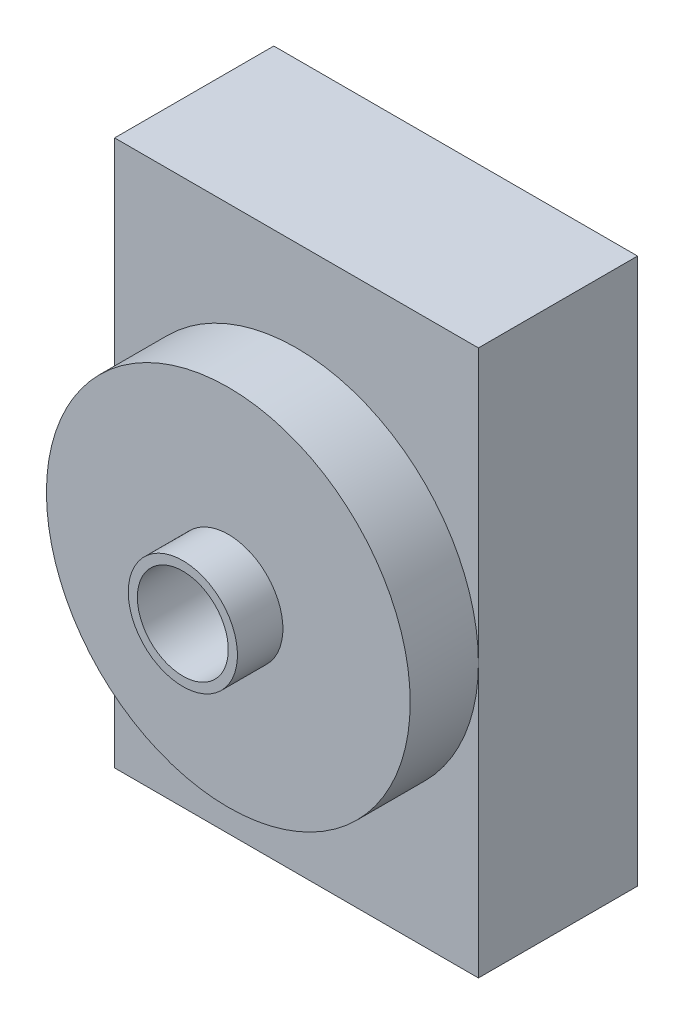
ISO-10303-21;
HEADER;
FILE_DESCRIPTION(('STEP AP214'),'2;1');
FILE_NAME('part.step','',(''),(''),'','','');
FILE_SCHEMA(('AUTOMOTIVE_DESIGN { 1 0 10303 214 1 1 1 1 }'));
ENDSEC;
DATA;
#1=APPLICATION_CONTEXT('core data for automotive mechanical design processes');
#2=APPLICATION_PROTOCOL_DEFINITION('international standard','automotive_design',2000,#1);
#3=PRODUCT_CONTEXT('',#1,'mechanical');
#4=PRODUCT('Part','Part','',(#3));
#5=PRODUCT_RELATED_PRODUCT_CATEGORY('part','',(#4));
#6=PRODUCT_DEFINITION_FORMATION('','',#4);
#7=PRODUCT_DEFINITION_CONTEXT('part definition',#1,'design');
#8=PRODUCT_DEFINITION('design','',#6,#7);
#9=PRODUCT_DEFINITION_SHAPE('','',#8);
#10=(LENGTH_UNIT() NAMED_UNIT(*) SI_UNIT(.MILLI.,.METRE.));
#11=(NAMED_UNIT(*) PLANE_ANGLE_UNIT() SI_UNIT($,.RADIAN.));
#12=(NAMED_UNIT(*) SI_UNIT($,.STERADIAN.) SOLID_ANGLE_UNIT());
#13=UNCERTAINTY_MEASURE_WITH_UNIT(LENGTH_MEASURE(1.E-05),#10,'distance_accuracy_value','');
#14=(GEOMETRIC_REPRESENTATION_CONTEXT(3) GLOBAL_UNCERTAINTY_ASSIGNED_CONTEXT((#13)) GLOBAL_UNIT_ASSIGNED_CONTEXT((#10,
#11,#12)) REPRESENTATION_CONTEXT('',''));
#15=CARTESIAN_POINT('',(0.,0.,0.));
#16=DIRECTION('',(0.,0.,1.));
#17=DIRECTION('',(1.,0.,0.));
#18=AXIS2_PLACEMENT_3D('',#15,#16,#17);
#19=CARTESIAN_POINT('',(0.,0.,31.75));
#20=DIRECTION('',(0.,0.,-1.));
#21=DIRECTION('',(-1.,0.,0.));
#22=AXIS2_PLACEMENT_3D('',#19,#20,#21);
#23=CYLINDRICAL_SURFACE('',#22,25.4);
#24=CARTESIAN_POINT('',(0.,0.,22.225));
#25=DIRECTION('',(0.,0.,1.));
#26=DIRECTION('',(1.,0.,0.));
#27=AXIS2_PLACEMENT_3D('',#24,#25,#26);
#28=CIRCLE('',#27,25.4);
#29=CARTESIAN_POINT('',(-25.4,0.,22.225));
#30=VERTEX_POINT('',#29);
#31=CARTESIAN_POINT('',(25.4,0.,22.225));
#32=VERTEX_POINT('',#31);
#33=EDGE_CURVE('E36',#30,#32,#28,.T.);
#34=ORIENTED_EDGE('',*,*,#33,.T.);
#35=EDGE_CURVE('E11',#32,#30,#28,.T.);
#36=ORIENTED_EDGE('',*,*,#35,.T.);
#37=EDGE_LOOP('',(#34,#36));
#38=FACE_BOUND('',#37,.T.);
#39=CARTESIAN_POINT('',(0.,0.,31.75));
#40=DIRECTION('',(0.,0.,1.));
#41=DIRECTION('',(1.,0.,0.));
#42=AXIS2_PLACEMENT_3D('',#39,#40,#41);
#43=CIRCLE('',#42,25.4);
#44=CARTESIAN_POINT('',(25.4,0.,31.75));
#45=VERTEX_POINT('',#44);
#46=EDGE_CURVE('E109',#45,#45,#43,.T.);
#47=ORIENTED_EDGE('',*,*,#46,.F.);
#48=EDGE_LOOP('',(#47));
#49=FACE_BOUND('',#48,.T.);
#50=ADVANCED_FACE('F33',(#38,#49),#23,.T.);
#51=CARTESIAN_POINT('',(0.,0.,31.75));
#52=DIRECTION('',(0.,0.,1.));
#53=DIRECTION('',(1.,0.,0.));
#54=AXIS2_PLACEMENT_3D('',#51,#52,#53);
#55=PLANE('',#54);
#56=CARTESIAN_POINT('',(0.,0.,31.75));
#57=DIRECTION('',(0.,0.,1.));
#58=DIRECTION('',(1.,0.,0.));
#59=AXIS2_PLACEMENT_3D('',#56,#57,#58);
#60=CIRCLE('',#59,7.62);
#61=CARTESIAN_POINT('',(-7.62,0.,31.75));
#62=VERTEX_POINT('',#61);
#63=EDGE_CURVE('E102',#62,#62,#60,.F.);
#64=ORIENTED_EDGE('',*,*,#63,.T.);
#65=EDGE_LOOP('',(#64));
#66=FACE_BOUND('',#65,.T.);
#67=ORIENTED_EDGE('',*,*,#46,.T.);
#68=EDGE_LOOP('',(#67));
#69=FACE_BOUND('',#68,.T.);
#70=ADVANCED_FACE('F155',(#66,#69),#55,.T.);
#71=CARTESIAN_POINT('',(0.,0.,38.1));
#72=DIRECTION('',(0.,0.,-1.));
#73=DIRECTION('',(-1.,0.,0.));
#74=AXIS2_PLACEMENT_3D('',#71,#72,#73);
#75=CYLINDRICAL_SURFACE('',#74,7.62);
#76=CARTESIAN_POINT('',(0.,0.,38.1));
#77=DIRECTION('',(0.,0.,1.));
#78=DIRECTION('',(1.,0.,0.));
#79=AXIS2_PLACEMENT_3D('',#76,#77,#78);
#80=CIRCLE('',#79,7.62);
#81=CARTESIAN_POINT('',(-7.62,0.,38.1));
#82=VERTEX_POINT('',#81);
#83=EDGE_CURVE('E99',#82,#82,#80,.T.);
#84=CARTESIAN_POINT('',(-7.62,0.,31.75));
#85=CARTESIAN_POINT('',(-7.62,0.,31.8161458333333));
#86=CARTESIAN_POINT('',(-7.62,0.,31.8822916666667));
#87=CARTESIAN_POINT('',(-7.62,0.,32.0145833333333));
#88=CARTESIAN_POINT('',(-7.62,0.,32.0807291666667));
#89=CARTESIAN_POINT('',(-7.62,0.,32.2130208333333));
#90=CARTESIAN_POINT('',(-7.62,0.,32.2791666666667));
#91=CARTESIAN_POINT('',(-7.62,0.,32.4114583333333));
#92=CARTESIAN_POINT('',(-7.62,0.,32.4776041666667));
#93=CARTESIAN_POINT('',(-7.62,0.,32.6098958333333));
#94=CARTESIAN_POINT('',(-7.62,0.,32.6760416666667));
#95=CARTESIAN_POINT('',(-7.62,0.,32.8083333333333));
#96=CARTESIAN_POINT('',(-7.62,0.,32.8744791666667));
#97=CARTESIAN_POINT('',(-7.62,0.,33.0067708333333));
#98=CARTESIAN_POINT('',(-7.62,0.,33.0729166666667));
#99=CARTESIAN_POINT('',(-7.62,0.,33.2052083333333));
#100=CARTESIAN_POINT('',(-7.62,0.,33.2713541666667));
#101=CARTESIAN_POINT('',(-7.62,0.,33.4036458333333));
#102=CARTESIAN_POINT('',(-7.62,0.,33.4697916666667));
#103=CARTESIAN_POINT('',(-7.62,0.,33.6020833333333));
#104=CARTESIAN_POINT('',(-7.62,0.,33.6682291666667));
#105=CARTESIAN_POINT('',(-7.62,0.,33.8005208333333));
#106=CARTESIAN_POINT('',(-7.62,0.,33.8666666666667));
#107=CARTESIAN_POINT('',(-7.62,0.,33.9989583333333));
#108=CARTESIAN_POINT('',(-7.62,0.,34.0651041666667));
#109=CARTESIAN_POINT('',(-7.62,0.,34.1973958333333));
#110=CARTESIAN_POINT('',(-7.62,0.,34.2635416666667));
#111=CARTESIAN_POINT('',(-7.62,0.,34.3958333333333));
#112=CARTESIAN_POINT('',(-7.62,0.,34.4619791666667));
#113=CARTESIAN_POINT('',(-7.62,0.,34.5942708333333));
#114=CARTESIAN_POINT('',(-7.62,0.,34.6604166666667));
#115=CARTESIAN_POINT('',(-7.62,0.,34.7927083333333));
#116=CARTESIAN_POINT('',(-7.62,0.,34.8588541666667));
#117=CARTESIAN_POINT('',(-7.62,0.,34.9911458333333));
#118=CARTESIAN_POINT('',(-7.62,0.,35.0572916666667));
#119=CARTESIAN_POINT('',(-7.62,0.,35.1895833333333));
#120=CARTESIAN_POINT('',(-7.62,0.,35.2557291666667));
#121=CARTESIAN_POINT('',(-7.62,0.,35.3880208333333));
#122=CARTESIAN_POINT('',(-7.62,0.,35.4541666666667));
#123=CARTESIAN_POINT('',(-7.62,0.,35.5864583333333));
#124=CARTESIAN_POINT('',(-7.62,0.,35.6526041666667));
#125=CARTESIAN_POINT('',(-7.62,0.,35.7848958333333));
#126=CARTESIAN_POINT('',(-7.62,0.,35.8510416666667));
#127=CARTESIAN_POINT('',(-7.62,0.,35.9833333333333));
#128=CARTESIAN_POINT('',(-7.62,0.,36.0494791666667));
#129=CARTESIAN_POINT('',(-7.62,0.,36.1817708333333));
#130=CARTESIAN_POINT('',(-7.62,0.,36.2479166666667));
#131=CARTESIAN_POINT('',(-7.62,0.,36.3802083333333));
#132=CARTESIAN_POINT('',(-7.62,0.,36.4463541666667));
#133=CARTESIAN_POINT('',(-7.62,0.,36.5786458333333));
#134=CARTESIAN_POINT('',(-7.62,0.,36.6447916666667));
#135=CARTESIAN_POINT('',(-7.62,0.,36.7770833333333));
#136=CARTESIAN_POINT('',(-7.62,0.,36.8432291666667));
#137=CARTESIAN_POINT('',(-7.62,0.,36.9755208333333));
#138=CARTESIAN_POINT('',(-7.62,0.,37.0416666666667));
#139=CARTESIAN_POINT('',(-7.62,0.,37.1739583333333));
#140=CARTESIAN_POINT('',(-7.62,0.,37.2401041666667));
#141=CARTESIAN_POINT('',(-7.62,0.,37.3723958333333));
#142=CARTESIAN_POINT('',(-7.62,0.,37.4385416666667));
#143=CARTESIAN_POINT('',(-7.62,0.,37.5708333333333));
#144=CARTESIAN_POINT('',(-7.62,0.,37.6369791666667));
#145=CARTESIAN_POINT('',(-7.62,0.,37.7692708333333));
#146=CARTESIAN_POINT('',(-7.62,0.,37.8354166666667));
#147=CARTESIAN_POINT('',(-7.62,0.,37.9677083333333));
#148=CARTESIAN_POINT('',(-7.62,0.,38.0338541666667));
#149=CARTESIAN_POINT('',(-7.62,0.,38.1));
#150=B_SPLINE_CURVE_WITH_KNOTS('',3,(#84,#85,#86,#87,#88,#89,#90,#91,#92,#93,#94,#95,#96,#97,
#98,#99,#100,#101,#102,#103,#104,#105,#106,#107,#108,#109,#110,#111,#112,#113,#114,#115,#116,
#117,#118,#119,#120,#121,#122,#123,#124,#125,#126,#127,#128,#129,#130,#131,#132,#133,#134,#135,
#136,#137,#138,#139,#140,#141,#142,#143,#144,#145,#146,#147,#148,#149),.UNSPECIFIED.,.F.,.F.,(4,
2,2,2,2,2,2,2,2,2,2,2,2,2,2,2,2,2,2,2,2,2,2,2,2,2,2,2,2,2,2,2,4),(0.,0.198437500000002,
0.396875000000005,0.5953125,0.793750000000003,0.992187500000005,1.190625,1.3890625,
1.58750000000001,1.7859375,1.984375,2.18281250000001,2.38125,2.5796875,2.77812500000001,
2.9765625,3.175,3.37343750000001,3.571875,3.7703125,3.96875000000001,4.1671875,4.365625,
4.56406250000001,4.7625,4.96093750000001,5.15937500000001,5.3578125,5.55625000000001,
5.75468750000001,5.953125,6.15156250000001,6.35000000000001),.UNSPECIFIED.);
#151=EDGE_CURVE('BSEAM159',#62,#82,#150,.T.);
#152=ORIENTED_EDGE('',*,*,#63,.F.);
#153=ORIENTED_EDGE('',*,*,#83,.F.);
#154=ORIENTED_EDGE('',*,*,#151,.T.);
#155=ORIENTED_EDGE('',*,*,#151,.F.);
#156=EDGE_LOOP('',(#152,#154,#153,#155));
#157=FACE_BOUND('',#156,.T.);
#158=ADVANCED_FACE('F159',(#157),#75,.T.);
#159=CARTESIAN_POINT('',(0.,0.,38.1));
#160=DIRECTION('',(0.,0.,1.));
#161=DIRECTION('',(1.,0.,0.));
#162=AXIS2_PLACEMENT_3D('',#159,#160,#161);
#163=PLANE('',#162);
#164=CARTESIAN_POINT('',(0.,0.,38.1));
#165=DIRECTION('',(0.,0.,1.));
#166=DIRECTION('',(1.,0.,0.));
#167=AXIS2_PLACEMENT_3D('',#164,#165,#166);
#168=CIRCLE('',#167,6.35);
#169=CARTESIAN_POINT('',(-6.35,0.,38.1));
#170=VERTEX_POINT('',#169);
#171=EDGE_CURVE('E131',#170,#170,#168,.T.);
#172=ORIENTED_EDGE('',*,*,#171,.F.);
#173=EDGE_LOOP('',(#172));
#174=FACE_BOUND('',#173,.T.);
#175=ORIENTED_EDGE('',*,*,#83,.T.);
#176=EDGE_LOOP('',(#175));
#177=FACE_BOUND('',#176,.T.);
#178=ADVANCED_FACE('F165',(#174,#177),#163,.T.);
#179=CARTESIAN_POINT('',(0.,0.,22.225));
#180=DIRECTION('',(0.,0.,1.));
#181=DIRECTION('',(1.,0.,0.));
#182=AXIS2_PLACEMENT_3D('',#179,#180,#181);
#183=PLANE('',#182);
#184=ORIENTED_EDGE('',*,*,#35,.F.);
#185=DIRECTION('',(0.,1.,0.));
#186=VECTOR('',#185,1.);
#187=CARTESIAN_POINT('',(25.4,-38.1,22.225));
#188=LINE('',#187,#186);
#189=CARTESIAN_POINT('',(25.4,38.1,22.225));
#190=VERTEX_POINT('',#189);
#191=EDGE_CURVE('E93',#32,#190,#188,.T.);
#192=ORIENTED_EDGE('',*,*,#191,.T.);
#193=DIRECTION('',(-1.,0.,0.));
#194=VECTOR('',#193,1.);
#195=CARTESIAN_POINT('',(25.4,38.1,22.225));
#196=LINE('',#195,#194);
#197=CARTESIAN_POINT('',(-25.4,38.1,22.225));
#198=VERTEX_POINT('',#197);
#199=EDGE_CURVE('E120',#190,#198,#196,.T.);
#200=ORIENTED_EDGE('',*,*,#199,.T.);
#201=DIRECTION('',(0.,-1.,0.));
#202=VECTOR('',#201,1.);
#203=CARTESIAN_POINT('',(-25.4,-38.1,22.225));
#204=LINE('',#203,#202);
#205=EDGE_CURVE('E83',#198,#30,#204,.T.);
#206=ORIENTED_EDGE('',*,*,#205,.T.);
#207=EDGE_LOOP('',(#184,#192,#200,#206));
#208=FACE_BOUND('',#207,.T.);
#209=ADVANCED_FACE('F117',(#208),#183,.T.);
#210=CARTESIAN_POINT('',(-25.4,-38.1,22.225));
#211=DIRECTION('',(1.,0.,0.));
#212=DIRECTION('',(0.,0.,-1.));
#213=AXIS2_PLACEMENT_3D('',#210,#211,#212);
#214=PLANE('',#213);
#215=CARTESIAN_POINT('',(-25.4,-38.1,22.225));
#216=VERTEX_POINT('',#215);
#217=EDGE_CURVE('E74',#30,#216,#204,.T.);
#218=ORIENTED_EDGE('',*,*,#217,.F.);
#219=ORIENTED_EDGE('',*,*,#205,.F.);
#220=DIRECTION('',(0.,0.,-1.));
#221=VECTOR('',#220,1.);
#222=CARTESIAN_POINT('',(-25.4,38.1,22.225));
#223=LINE('',#222,#221);
#224=CARTESIAN_POINT('',(-25.4,38.1,0.));
#225=VERTEX_POINT('',#224);
#226=EDGE_CURVE('E128',#198,#225,#223,.T.);
#227=ORIENTED_EDGE('',*,*,#226,.T.);
#228=DIRECTION('',(0.,-1.,0.));
#229=VECTOR('',#228,1.);
#230=CARTESIAN_POINT('',(-25.4,-38.1,0.));
#231=LINE('',#230,#229);
#232=CARTESIAN_POINT('',(-25.4,-38.1,0.));
#233=VERTEX_POINT('',#232);
#234=EDGE_CURVE('E97',#225,#233,#231,.T.);
#235=ORIENTED_EDGE('',*,*,#234,.T.);
#236=DIRECTION('',(0.,0.,-1.));
#237=VECTOR('',#236,1.);
#238=CARTESIAN_POINT('',(-25.4,-38.1,22.225));
#239=LINE('',#238,#237);
#240=EDGE_CURVE('E90',#216,#233,#239,.T.);
#241=ORIENTED_EDGE('',*,*,#240,.F.);
#242=EDGE_LOOP('',(#218,#219,#227,#235,#241));
#243=FACE_BOUND('',#242,.T.);
#244=ADVANCED_FACE('F95',(#243),#214,.F.);
#245=CARTESIAN_POINT('',(25.4,-38.1,22.225));
#246=DIRECTION('',(-1.,0.,0.));
#247=DIRECTION('',(0.,0.,1.));
#248=AXIS2_PLACEMENT_3D('',#245,#246,#247);
#249=PLANE('',#248);
#250=ORIENTED_EDGE('',*,*,#191,.F.);
#251=CARTESIAN_POINT('',(25.4,-38.1,22.225));
#252=VERTEX_POINT('',#251);
#253=EDGE_CURVE('E47',#252,#32,#188,.T.);
#254=ORIENTED_EDGE('',*,*,#253,.F.);
#255=DIRECTION('',(0.,0.,-1.));
#256=VECTOR('',#255,1.);
#257=CARTESIAN_POINT('',(25.4,-38.1,22.225));
#258=LINE('',#257,#256);
#259=CARTESIAN_POINT('',(25.4,-38.1,0.));
#260=VERTEX_POINT('',#259);
#261=EDGE_CURVE('E92',#252,#260,#258,.T.);
#262=ORIENTED_EDGE('',*,*,#261,.T.);
#263=DIRECTION('',(0.,1.,0.));
#264=VECTOR('',#263,1.);
#265=CARTESIAN_POINT('',(25.4,-38.1,0.));
#266=LINE('',#265,#264);
#267=CARTESIAN_POINT('',(25.4,38.1,0.));
#268=VERTEX_POINT('',#267);
#269=EDGE_CURVE('E133',#260,#268,#266,.T.);
#270=ORIENTED_EDGE('',*,*,#269,.T.);
#271=DIRECTION('',(0.,0.,-1.));
#272=VECTOR('',#271,1.);
#273=CARTESIAN_POINT('',(25.4,38.1,22.225));
#274=LINE('',#273,#272);
#275=EDGE_CURVE('E104',#190,#268,#274,.T.);
#276=ORIENTED_EDGE('',*,*,#275,.F.);
#277=EDGE_LOOP('',(#250,#254,#262,#270,#276));
#278=FACE_BOUND('',#277,.T.);
#279=ADVANCED_FACE('F144',(#278),#249,.F.);
#280=CARTESIAN_POINT('',(25.4,-38.1,22.225));
#281=DIRECTION('',(0.,1.,0.));
#282=DIRECTION('',(0.,0.,1.));
#283=AXIS2_PLACEMENT_3D('',#280,#281,#282);
#284=PLANE('',#283);
#285=DIRECTION('',(1.,0.,0.));
#286=VECTOR('',#285,1.);
#287=CARTESIAN_POINT('',(25.4,-38.1,0.));
#288=LINE('',#287,#286);
#289=EDGE_CURVE('E130',#233,#260,#288,.T.);
#290=ORIENTED_EDGE('',*,*,#289,.T.);
#291=ORIENTED_EDGE('',*,*,#261,.F.);
#292=DIRECTION('',(1.,0.,0.));
#293=VECTOR('',#292,1.);
#294=CARTESIAN_POINT('',(25.4,-38.1,22.225));
#295=LINE('',#294,#293);
#296=EDGE_CURVE('E77',#216,#252,#295,.T.);
#297=ORIENTED_EDGE('',*,*,#296,.F.);
#298=ORIENTED_EDGE('',*,*,#240,.T.);
#299=EDGE_LOOP('',(#290,#291,#297,#298));
#300=FACE_BOUND('',#299,.T.);
#301=ADVANCED_FACE('F89',(#300),#284,.F.);
#302=CARTESIAN_POINT('',(25.4,38.1,22.225));
#303=DIRECTION('',(0.,-1.,0.));
#304=DIRECTION('',(0.,0.,-1.));
#305=AXIS2_PLACEMENT_3D('',#302,#303,#304);
#306=PLANE('',#305);
#307=DIRECTION('',(-1.,0.,0.));
#308=VECTOR('',#307,1.);
#309=CARTESIAN_POINT('',(25.4,38.1,0.));
#310=LINE('',#309,#308);
#311=EDGE_CURVE('E84',#268,#225,#310,.T.);
#312=ORIENTED_EDGE('',*,*,#311,.T.);
#313=ORIENTED_EDGE('',*,*,#226,.F.);
#314=ORIENTED_EDGE('',*,*,#199,.F.);
#315=ORIENTED_EDGE('',*,*,#275,.T.);
#316=EDGE_LOOP('',(#312,#313,#314,#315));
#317=FACE_BOUND('',#316,.T.);
#318=ADVANCED_FACE('F140',(#317),#306,.F.);
#319=ORIENTED_EDGE('',*,*,#33,.F.);
#320=ORIENTED_EDGE('',*,*,#217,.T.);
#321=ORIENTED_EDGE('',*,*,#296,.T.);
#322=ORIENTED_EDGE('',*,*,#253,.T.);
#323=EDGE_LOOP('',(#319,#320,#321,#322));
#324=FACE_BOUND('',#323,.T.);
#325=ADVANCED_FACE('F76',(#324),#183,.T.);
#326=CARTESIAN_POINT('',(0.,0.,0.));
#327=DIRECTION('',(0.,0.,1.));
#328=DIRECTION('',(1.,0.,0.));
#329=AXIS2_PLACEMENT_3D('',#326,#327,#328);
#330=PLANE('',#329);
#331=CARTESIAN_POINT('',(0.,0.,0.));
#332=DIRECTION('',(0.,0.,1.));
#333=DIRECTION('',(1.,0.,0.));
#334=AXIS2_PLACEMENT_3D('',#331,#332,#333);
#335=CIRCLE('',#334,6.35);
#336=CARTESIAN_POINT('',(-6.35,0.,0.));
#337=VERTEX_POINT('',#336);
#338=EDGE_CURVE('E123',#337,#337,#335,.T.);
#339=ORIENTED_EDGE('',*,*,#338,.T.);
#340=EDGE_LOOP('',(#339));
#341=FACE_BOUND('',#340,.T.);
#342=ORIENTED_EDGE('',*,*,#234,.F.);
#343=ORIENTED_EDGE('',*,*,#311,.F.);
#344=ORIENTED_EDGE('',*,*,#269,.F.);
#345=ORIENTED_EDGE('',*,*,#289,.F.);
#346=EDGE_LOOP('',(#342,#343,#344,#345));
#347=FACE_BOUND('',#346,.T.);
#348=ADVANCED_FACE('F143',(#341,#347),#330,.F.);
#349=CARTESIAN_POINT('',(0.,0.,38.1));
#350=DIRECTION('',(0.,0.,-1.));
#351=DIRECTION('',(-1.,0.,0.));
#352=AXIS2_PLACEMENT_3D('',#349,#350,#351);
#353=CYLINDRICAL_SURFACE('',#352,6.35);
#354=CARTESIAN_POINT('',(-6.35,0.,38.1));
#355=CARTESIAN_POINT('',(-6.35,0.,37.703125));
#356=CARTESIAN_POINT('',(-6.35,0.,37.30625));
#357=CARTESIAN_POINT('',(-6.35,0.,36.5125));
#358=CARTESIAN_POINT('',(-6.35,0.,36.115625));
#359=CARTESIAN_POINT('',(-6.35,0.,35.321875));
#360=CARTESIAN_POINT('',(-6.35,0.,34.925));
#361=CARTESIAN_POINT('',(-6.35,0.,34.13125));
#362=CARTESIAN_POINT('',(-6.35,0.,33.734375));
#363=CARTESIAN_POINT('',(-6.35,0.,32.940625));
#364=CARTESIAN_POINT('',(-6.35,0.,32.54375));
#365=CARTESIAN_POINT('',(-6.35,0.,31.75));
#366=CARTESIAN_POINT('',(-6.35,0.,31.353125));
#367=CARTESIAN_POINT('',(-6.35,0.,30.559375));
#368=CARTESIAN_POINT('',(-6.35,0.,30.1625));
#369=CARTESIAN_POINT('',(-6.35,0.,29.36875));
#370=CARTESIAN_POINT('',(-6.35,0.,28.971875));
#371=CARTESIAN_POINT('',(-6.35,0.,28.178125));
#372=CARTESIAN_POINT('',(-6.35,0.,27.78125));
#373=CARTESIAN_POINT('',(-6.35,0.,26.9875));
#374=CARTESIAN_POINT('',(-6.35,0.,26.590625));
#375=CARTESIAN_POINT('',(-6.35,0.,25.796875));
#376=CARTESIAN_POINT('',(-6.35,0.,25.4));
#377=CARTESIAN_POINT('',(-6.35,0.,24.60625));
#378=CARTESIAN_POINT('',(-6.35,0.,24.209375));
#379=CARTESIAN_POINT('',(-6.35,0.,23.415625));
#380=CARTESIAN_POINT('',(-6.35,0.,23.01875));
#381=CARTESIAN_POINT('',(-6.35,0.,22.225));
#382=CARTESIAN_POINT('',(-6.35,0.,21.828125));
#383=CARTESIAN_POINT('',(-6.35,0.,21.034375));
#384=CARTESIAN_POINT('',(-6.35,0.,20.6375));
#385=CARTESIAN_POINT('',(-6.35,0.,19.84375));
#386=CARTESIAN_POINT('',(-6.35,0.,19.446875));
#387=CARTESIAN_POINT('',(-6.35,0.,18.653125));
#388=CARTESIAN_POINT('',(-6.35,0.,18.25625));
#389=CARTESIAN_POINT('',(-6.35,0.,17.4625));
#390=CARTESIAN_POINT('',(-6.35,0.,17.065625));
#391=CARTESIAN_POINT('',(-6.35,0.,16.271875));
#392=CARTESIAN_POINT('',(-6.35,0.,15.875));
#393=CARTESIAN_POINT('',(-6.35,0.,15.08125));
#394=CARTESIAN_POINT('',(-6.35,0.,14.684375));
#395=CARTESIAN_POINT('',(-6.35,0.,13.890625));
#396=CARTESIAN_POINT('',(-6.35,0.,13.49375));
#397=CARTESIAN_POINT('',(-6.35,0.,12.7));
#398=CARTESIAN_POINT('',(-6.35,0.,12.303125));
#399=CARTESIAN_POINT('',(-6.35,0.,11.509375));
#400=CARTESIAN_POINT('',(-6.35,0.,11.1125));
#401=CARTESIAN_POINT('',(-6.35,0.,10.31875));
#402=CARTESIAN_POINT('',(-6.35,0.,9.921875));
#403=CARTESIAN_POINT('',(-6.35,0.,9.128125));
#404=CARTESIAN_POINT('',(-6.35,0.,8.73125));
#405=CARTESIAN_POINT('',(-6.35,0.,7.9375));
#406=CARTESIAN_POINT('',(-6.35,0.,7.540625));
#407=CARTESIAN_POINT('',(-6.35,0.,6.746875));
#408=CARTESIAN_POINT('',(-6.35,0.,6.35));
#409=CARTESIAN_POINT('',(-6.35,0.,5.55625));
#410=CARTESIAN_POINT('',(-6.35,0.,5.159375));
#411=CARTESIAN_POINT('',(-6.35,0.,4.365625));
#412=CARTESIAN_POINT('',(-6.35,0.,3.96875));
#413=CARTESIAN_POINT('',(-6.35,0.,3.175));
#414=CARTESIAN_POINT('',(-6.35,0.,2.778125));
#415=CARTESIAN_POINT('',(-6.35,0.,1.984375));
#416=CARTESIAN_POINT('',(-6.35,0.,1.5875));
#417=CARTESIAN_POINT('',(-6.35,0.,0.79375));
#418=CARTESIAN_POINT('',(-6.35,0.,0.396875));
#419=CARTESIAN_POINT('',(-6.35,0.,0.));
#420=B_SPLINE_CURVE_WITH_KNOTS('',3,(#354,#355,#356,#357,#358,#359,#360,#361,#362,#363,#364,
#365,#366,#367,#368,#369,#370,#371,#372,#373,#374,#375,#376,#377,#378,#379,#380,#381,#382,#383,
#384,#385,#386,#387,#388,#389,#390,#391,#392,#393,#394,#395,#396,#397,#398,#399,#400,#401,#402,
#403,#404,#405,#406,#407,#408,#409,#410,#411,#412,#413,#414,#415,#416,#417,#418,#419),
.UNSPECIFIED.,.F.,.F.,(4,2,2,2,2,2,2,2,2,2,2,2,2,2,2,2,2,2,2,2,2,2,2,2,2,2,2,2,2,2,2,2,4),(0.,
1.19062499999999,2.38124999999999,3.571875,4.7625,5.953125,7.14375,8.33437499999999,9.525,
10.715625,11.90625,13.096875,14.2875,15.478125,16.66875,17.859375,19.05,20.240625,21.43125,
22.621875,23.8125,25.003125,26.19375,27.384375,28.575,29.765625,30.95625,32.146875,33.3375,
34.528125,35.71875,36.909375,38.1),.UNSPECIFIED.);
#421=EDGE_CURVE('BSEAM170',#170,#337,#420,.T.);
#422=ORIENTED_EDGE('',*,*,#171,.T.);
#423=ORIENTED_EDGE('',*,*,#338,.F.);
#424=ORIENTED_EDGE('',*,*,#421,.T.);
#425=ORIENTED_EDGE('',*,*,#421,.F.);
#426=EDGE_LOOP('',(#422,#424,#423,#425));
#427=FACE_BOUND('',#426,.T.);
#428=ADVANCED_FACE('F170',(#427),#353,.F.);
#429=CLOSED_SHELL('',(#50,#70,#158,#178,#209,#244,#279,#301,#318,#325,#348,#428));
#430=MANIFOLD_SOLID_BREP('B2',#429);
#431=ADVANCED_BREP_SHAPE_REPRESENTATION('',(#18,#430),#14);
#432=SHAPE_DEFINITION_REPRESENTATION(#9,#431);
ENDSEC;
END-ISO-10303-21;
